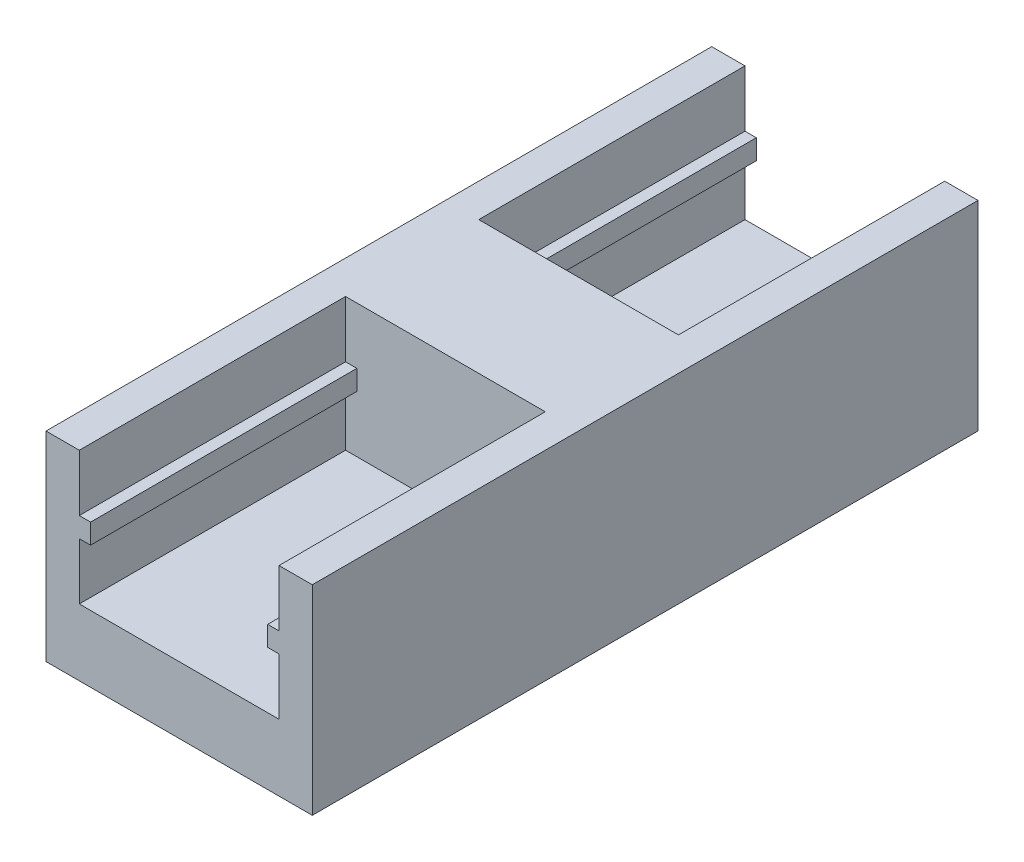
ISO-10303-21;
HEADER;
FILE_DESCRIPTION(('STEP AP214'),'2;1');
FILE_NAME('part.step','',(''),(''),'','','');
FILE_SCHEMA(('AUTOMOTIVE_DESIGN { 1 0 10303 214 1 1 1 1 }'));
ENDSEC;
DATA;
#1=APPLICATION_CONTEXT('core data for automotive mechanical design processes');
#2=APPLICATION_PROTOCOL_DEFINITION('international standard','automotive_design',2000,#1);
#3=PRODUCT_CONTEXT('',#1,'mechanical');
#4=PRODUCT('Part','Part','',(#3));
#5=PRODUCT_RELATED_PRODUCT_CATEGORY('part','',(#4));
#6=PRODUCT_DEFINITION_FORMATION('','',#4);
#7=PRODUCT_DEFINITION_CONTEXT('part definition',#1,'design');
#8=PRODUCT_DEFINITION('design','',#6,#7);
#9=PRODUCT_DEFINITION_SHAPE('','',#8);
#10=(LENGTH_UNIT() NAMED_UNIT(*) SI_UNIT(.MILLI.,.METRE.));
#11=(NAMED_UNIT(*) PLANE_ANGLE_UNIT() SI_UNIT($,.RADIAN.));
#12=(NAMED_UNIT(*) SI_UNIT($,.STERADIAN.) SOLID_ANGLE_UNIT());
#13=UNCERTAINTY_MEASURE_WITH_UNIT(LENGTH_MEASURE(1.E-05),#10,'distance_accuracy_value','');
#14=(GEOMETRIC_REPRESENTATION_CONTEXT(3) GLOBAL_UNCERTAINTY_ASSIGNED_CONTEXT((#13)) GLOBAL_UNIT_ASSIGNED_CONTEXT((#10,
#11,#12)) REPRESENTATION_CONTEXT('',''));
#15=CARTESIAN_POINT('',(0.,0.,0.));
#16=DIRECTION('',(0.,0.,1.));
#17=DIRECTION('',(1.,0.,0.));
#18=AXIS2_PLACEMENT_3D('',#15,#16,#17);
#19=CARTESIAN_POINT('',(-10.,7.5,50.));
#20=DIRECTION('',(0.,-1.,0.));
#21=DIRECTION('',(0.,0.,-1.));
#22=AXIS2_PLACEMENT_3D('',#19,#20,#21);
#23=PLANE('',#22);
#24=DIRECTION('',(0.,0.,-1.));
#25=VECTOR('',#24,1.);
#26=CARTESIAN_POINT('',(7.5,7.5,20.));
#27=LINE('',#26,#25);
#28=CARTESIAN_POINT('',(7.5,7.5,20.));
#29=VERTEX_POINT('',#28);
#30=CARTESIAN_POINT('',(7.5,7.5,0.));
#31=VERTEX_POINT('',#30);
#32=EDGE_CURVE('E321',#29,#31,#27,.T.);
#33=ORIENTED_EDGE('',*,*,#32,.F.);
#34=DIRECTION('',(-1.,0.,0.));
#35=VECTOR('',#34,1.);
#36=CARTESIAN_POINT('',(-7.5,7.5,20.));
#37=LINE('',#36,#35);
#38=CARTESIAN_POINT('',(-7.5,7.5,20.));
#39=VERTEX_POINT('',#38);
#40=EDGE_CURVE('E244',#29,#39,#37,.T.);
#41=ORIENTED_EDGE('',*,*,#40,.T.);
#42=DIRECTION('',(0.,0.,-1.));
#43=VECTOR('',#42,1.);
#44=CARTESIAN_POINT('',(-7.5,7.5,20.));
#45=LINE('',#44,#43);
#46=CARTESIAN_POINT('',(-7.5,7.5,0.));
#47=VERTEX_POINT('',#46);
#48=EDGE_CURVE('E325',#39,#47,#45,.T.);
#49=ORIENTED_EDGE('',*,*,#48,.T.);
#50=DIRECTION('',(-1.,0.,0.));
#51=VECTOR('',#50,1.);
#52=CARTESIAN_POINT('',(-10.,7.5,0.));
#53=LINE('',#52,#51);
#54=CARTESIAN_POINT('',(-10.,7.5,0.));
#55=VERTEX_POINT('',#54);
#56=EDGE_CURVE('E501',#47,#55,#53,.T.);
#57=ORIENTED_EDGE('',*,*,#56,.T.);
#58=DIRECTION('',(0.,0.,-1.));
#59=VECTOR('',#58,1.);
#60=CARTESIAN_POINT('',(-10.,7.5,50.));
#61=LINE('',#60,#59);
#62=CARTESIAN_POINT('',(-10.,7.5,50.));
#63=VERTEX_POINT('',#62);
#64=EDGE_CURVE('E48',#63,#55,#61,.T.);
#65=ORIENTED_EDGE('',*,*,#64,.F.);
#66=DIRECTION('',(-1.,0.,0.));
#67=VECTOR('',#66,1.);
#68=CARTESIAN_POINT('',(-10.,7.5,50.));
#69=LINE('',#68,#67);
#70=CARTESIAN_POINT('',(-7.5,7.5,50.));
#71=VERTEX_POINT('',#70);
#72=EDGE_CURVE('E485',#71,#63,#69,.T.);
#73=ORIENTED_EDGE('',*,*,#72,.F.);
#74=DIRECTION('',(0.,0.,1.));
#75=VECTOR('',#74,1.);
#76=CARTESIAN_POINT('',(-7.5,7.5,30.));
#77=LINE('',#76,#75);
#78=CARTESIAN_POINT('',(-7.5,7.5,30.));
#79=VERTEX_POINT('',#78);
#80=EDGE_CURVE('E63',#79,#71,#77,.T.);
#81=ORIENTED_EDGE('',*,*,#80,.F.);
#82=DIRECTION('',(-1.,0.,0.));
#83=VECTOR('',#82,1.);
#84=CARTESIAN_POINT('',(-7.5,7.5,30.));
#85=LINE('',#84,#83);
#86=CARTESIAN_POINT('',(7.5,7.5,30.));
#87=VERTEX_POINT('',#86);
#88=EDGE_CURVE('E359',#87,#79,#85,.T.);
#89=ORIENTED_EDGE('',*,*,#88,.F.);
#90=DIRECTION('',(0.,0.,1.));
#91=VECTOR('',#90,1.);
#92=CARTESIAN_POINT('',(7.5,7.5,30.));
#93=LINE('',#92,#91);
#94=CARTESIAN_POINT('',(7.5,7.5,50.));
#95=VERTEX_POINT('',#94);
#96=EDGE_CURVE('E404',#87,#95,#93,.T.);
#97=ORIENTED_EDGE('',*,*,#96,.T.);
#98=CARTESIAN_POINT('',(10.,7.5,50.));
#99=VERTEX_POINT('',#98);
#100=EDGE_CURVE('E487',#99,#95,#69,.T.);
#101=ORIENTED_EDGE('',*,*,#100,.F.);
#102=DIRECTION('',(0.,0.,-1.));
#103=VECTOR('',#102,1.);
#104=CARTESIAN_POINT('',(10.,7.5,50.));
#105=LINE('',#104,#103);
#106=CARTESIAN_POINT('',(10.,7.5,0.));
#107=VERTEX_POINT('',#106);
#108=EDGE_CURVE('E11',#99,#107,#105,.T.);
#109=ORIENTED_EDGE('',*,*,#108,.T.);
#110=EDGE_CURVE('E502',#107,#31,#53,.T.);
#111=ORIENTED_EDGE('',*,*,#110,.T.);
#112=EDGE_LOOP('',(#33,#41,#49,#57,#65,#73,#81,#89,#97,#101,#109,#111));
#113=FACE_BOUND('',#112,.T.);
#114=ADVANCED_FACE('F39',(#113),#23,.F.);
#115=CARTESIAN_POINT('',(0.,0.,0.));
#116=DIRECTION('',(0.,0.,-1.));
#117=DIRECTION('',(-1.,0.,0.));
#118=AXIS2_PLACEMENT_3D('',#115,#116,#117);
#119=PLANE('',#118);
#120=DIRECTION('',(1.,0.,0.));
#121=VECTOR('',#120,1.);
#122=CARTESIAN_POINT('',(6.65,3.25,0.));
#123=LINE('',#122,#121);
#124=CARTESIAN_POINT('',(6.65,3.25,0.));
#125=VERTEX_POINT('',#124);
#126=CARTESIAN_POINT('',(7.5,3.25,0.));
#127=VERTEX_POINT('',#126);
#128=EDGE_CURVE('E287',#125,#127,#123,.T.);
#129=ORIENTED_EDGE('',*,*,#128,.T.);
#130=DIRECTION('',(0.,1.,0.));
#131=VECTOR('',#130,1.);
#132=CARTESIAN_POINT('',(7.5,3.25,0.));
#133=LINE('',#132,#131);
#134=EDGE_CURVE('E55',#127,#31,#133,.T.);
#135=ORIENTED_EDGE('',*,*,#134,.T.);
#136=ORIENTED_EDGE('',*,*,#110,.F.);
#137=DIRECTION('',(0.,1.,0.));
#138=VECTOR('',#137,1.);
#139=CARTESIAN_POINT('',(10.,-7.5,0.));
#140=LINE('',#139,#138);
#141=CARTESIAN_POINT('',(10.,-7.5,0.));
#142=VERTEX_POINT('',#141);
#143=EDGE_CURVE('E448',#142,#107,#140,.T.);
#144=ORIENTED_EDGE('',*,*,#143,.F.);
#145=DIRECTION('',(1.,0.,0.));
#146=VECTOR('',#145,1.);
#147=CARTESIAN_POINT('',(-10.,-7.5,0.));
#148=LINE('',#147,#146);
#149=CARTESIAN_POINT('',(-10.,-7.5,0.));
#150=VERTEX_POINT('',#149);
#151=EDGE_CURVE('E486',#150,#142,#148,.T.);
#152=ORIENTED_EDGE('',*,*,#151,.F.);
#153=DIRECTION('',(0.,-1.,0.));
#154=VECTOR('',#153,1.);
#155=CARTESIAN_POINT('',(-10.,-7.5,0.));
#156=LINE('',#155,#154);
#157=EDGE_CURVE('E506',#55,#150,#156,.T.);
#158=ORIENTED_EDGE('',*,*,#157,.F.);
#159=ORIENTED_EDGE('',*,*,#56,.F.);
#160=DIRECTION('',(0.,-1.,0.));
#161=VECTOR('',#160,1.);
#162=CARTESIAN_POINT('',(-7.5,3.25,0.));
#163=LINE('',#162,#161);
#164=CARTESIAN_POINT('',(-7.5,3.25,0.));
#165=VERTEX_POINT('',#164);
#166=EDGE_CURVE('E250',#47,#165,#163,.T.);
#167=ORIENTED_EDGE('',*,*,#166,.T.);
#168=DIRECTION('',(1.,0.,0.));
#169=VECTOR('',#168,1.);
#170=CARTESIAN_POINT('',(-6.65,3.25,0.));
#171=LINE('',#170,#169);
#172=CARTESIAN_POINT('',(-6.65,3.25,0.));
#173=VERTEX_POINT('',#172);
#174=EDGE_CURVE('E254',#165,#173,#171,.T.);
#175=ORIENTED_EDGE('',*,*,#174,.T.);
#176=DIRECTION('',(0.,-1.,0.));
#177=VECTOR('',#176,1.);
#178=CARTESIAN_POINT('',(-6.65,1.75,0.));
#179=LINE('',#178,#177);
#180=CARTESIAN_POINT('',(-6.65,1.75,0.));
#181=VERTEX_POINT('',#180);
#182=EDGE_CURVE('E314',#173,#181,#179,.T.);
#183=ORIENTED_EDGE('',*,*,#182,.T.);
#184=DIRECTION('',(-1.,0.,0.));
#185=VECTOR('',#184,1.);
#186=CARTESIAN_POINT('',(-6.65,1.75,0.));
#187=LINE('',#186,#185);
#188=CARTESIAN_POINT('',(-7.5,1.75,0.));
#189=VERTEX_POINT('',#188);
#190=EDGE_CURVE('E310',#181,#189,#187,.T.);
#191=ORIENTED_EDGE('',*,*,#190,.T.);
#192=DIRECTION('',(0.,-1.,0.));
#193=VECTOR('',#192,1.);
#194=CARTESIAN_POINT('',(-7.5,-2.5,0.));
#195=LINE('',#194,#193);
#196=CARTESIAN_POINT('',(-7.5,-2.5,0.));
#197=VERTEX_POINT('',#196);
#198=EDGE_CURVE('E306',#189,#197,#195,.T.);
#199=ORIENTED_EDGE('',*,*,#198,.T.);
#200=DIRECTION('',(1.,0.,0.));
#201=VECTOR('',#200,1.);
#202=CARTESIAN_POINT('',(-7.5,-2.5,0.));
#203=LINE('',#202,#201);
#204=CARTESIAN_POINT('',(7.5,-2.5,0.));
#205=VERTEX_POINT('',#204);
#206=EDGE_CURVE('E302',#197,#205,#203,.T.);
#207=ORIENTED_EDGE('',*,*,#206,.T.);
#208=DIRECTION('',(0.,1.,0.));
#209=VECTOR('',#208,1.);
#210=CARTESIAN_POINT('',(7.5,-2.5,0.));
#211=LINE('',#210,#209);
#212=CARTESIAN_POINT('',(7.5,1.75,0.));
#213=VERTEX_POINT('',#212);
#214=EDGE_CURVE('E298',#205,#213,#211,.T.);
#215=ORIENTED_EDGE('',*,*,#214,.T.);
#216=DIRECTION('',(-1.,0.,0.));
#217=VECTOR('',#216,1.);
#218=CARTESIAN_POINT('',(6.65,1.75,0.));
#219=LINE('',#218,#217);
#220=CARTESIAN_POINT('',(6.65,1.75,0.));
#221=VERTEX_POINT('',#220);
#222=EDGE_CURVE('E294',#213,#221,#219,.T.);
#223=ORIENTED_EDGE('',*,*,#222,.T.);
#224=DIRECTION('',(0.,1.,0.));
#225=VECTOR('',#224,1.);
#226=CARTESIAN_POINT('',(6.65,1.75,0.));
#227=LINE('',#226,#225);
#228=EDGE_CURVE('E290',#221,#125,#227,.T.);
#229=ORIENTED_EDGE('',*,*,#228,.T.);
#230=EDGE_LOOP('',(#129,#135,#136,#144,#152,#158,#159,#167,#175,#183,#191,#199,#207,#215,#223,#229));
#231=FACE_BOUND('',#230,.T.);
#232=ADVANCED_FACE('F530',(#231),#119,.T.);
#233=CARTESIAN_POINT('',(10.,-7.5,50.));
#234=DIRECTION('',(-1.,0.,0.));
#235=DIRECTION('',(0.,0.,1.));
#236=AXIS2_PLACEMENT_3D('',#233,#234,#235);
#237=PLANE('',#236);
#238=ORIENTED_EDGE('',*,*,#143,.T.);
#239=ORIENTED_EDGE('',*,*,#108,.F.);
#240=DIRECTION('',(0.,1.,0.));
#241=VECTOR('',#240,1.);
#242=CARTESIAN_POINT('',(10.,-7.5,50.));
#243=LINE('',#242,#241);
#244=CARTESIAN_POINT('',(10.,-7.5,50.));
#245=VERTEX_POINT('',#244);
#246=EDGE_CURVE('E481',#245,#99,#243,.T.);
#247=ORIENTED_EDGE('',*,*,#246,.F.);
#248=DIRECTION('',(0.,0.,-1.));
#249=VECTOR('',#248,1.);
#250=CARTESIAN_POINT('',(10.,-7.5,50.));
#251=LINE('',#250,#249);
#252=EDGE_CURVE('E497',#245,#142,#251,.T.);
#253=ORIENTED_EDGE('',*,*,#252,.T.);
#254=EDGE_LOOP('',(#238,#239,#247,#253));
#255=FACE_BOUND('',#254,.T.);
#256=ADVANCED_FACE('F41',(#255),#237,.F.);
#257=CARTESIAN_POINT('',(-10.,-7.5,50.));
#258=DIRECTION('',(1.,0.,0.));
#259=DIRECTION('',(0.,0.,-1.));
#260=AXIS2_PLACEMENT_3D('',#257,#258,#259);
#261=PLANE('',#260);
#262=ORIENTED_EDGE('',*,*,#157,.T.);
#263=DIRECTION('',(0.,0.,-1.));
#264=VECTOR('',#263,1.);
#265=CARTESIAN_POINT('',(-10.,-7.5,50.));
#266=LINE('',#265,#264);
#267=CARTESIAN_POINT('',(-10.,-7.5,50.));
#268=VERTEX_POINT('',#267);
#269=EDGE_CURVE('E514',#268,#150,#266,.T.);
#270=ORIENTED_EDGE('',*,*,#269,.F.);
#271=DIRECTION('',(0.,-1.,0.));
#272=VECTOR('',#271,1.);
#273=CARTESIAN_POINT('',(-10.,-7.5,50.));
#274=LINE('',#273,#272);
#275=EDGE_CURVE('E491',#63,#268,#274,.T.);
#276=ORIENTED_EDGE('',*,*,#275,.F.);
#277=ORIENTED_EDGE('',*,*,#64,.T.);
#278=EDGE_LOOP('',(#262,#270,#276,#277));
#279=FACE_BOUND('',#278,.T.);
#280=ADVANCED_FACE('F523',(#279),#261,.F.);
#281=CARTESIAN_POINT('',(-10.,-7.5,50.));
#282=DIRECTION('',(0.,1.,0.));
#283=DIRECTION('',(0.,0.,1.));
#284=AXIS2_PLACEMENT_3D('',#281,#282,#283);
#285=PLANE('',#284);
#286=ORIENTED_EDGE('',*,*,#151,.T.);
#287=ORIENTED_EDGE('',*,*,#252,.F.);
#288=DIRECTION('',(1.,0.,0.));
#289=VECTOR('',#288,1.);
#290=CARTESIAN_POINT('',(-10.,-7.5,50.));
#291=LINE('',#290,#289);
#292=EDGE_CURVE('E494',#268,#245,#291,.T.);
#293=ORIENTED_EDGE('',*,*,#292,.F.);
#294=ORIENTED_EDGE('',*,*,#269,.T.);
#295=EDGE_LOOP('',(#286,#287,#293,#294));
#296=FACE_BOUND('',#295,.T.);
#297=ADVANCED_FACE('F534',(#296),#285,.F.);
#298=CARTESIAN_POINT('',(0.,0.,50.));
#299=DIRECTION('',(0.,0.,-1.));
#300=DIRECTION('',(-1.,0.,0.));
#301=AXIS2_PLACEMENT_3D('',#298,#299,#300);
#302=PLANE('',#301);
#303=ORIENTED_EDGE('',*,*,#100,.T.);
#304=DIRECTION('',(0.,1.,0.));
#305=VECTOR('',#304,1.);
#306=CARTESIAN_POINT('',(7.5,3.25,50.));
#307=LINE('',#306,#305);
#308=CARTESIAN_POINT('',(7.5,3.25,50.));
#309=VERTEX_POINT('',#308);
#310=EDGE_CURVE('E324',#309,#95,#307,.T.);
#311=ORIENTED_EDGE('',*,*,#310,.F.);
#312=DIRECTION('',(1.,0.,0.));
#313=VECTOR('',#312,1.);
#314=CARTESIAN_POINT('',(6.65,3.25,50.));
#315=LINE('',#314,#313);
#316=CARTESIAN_POINT('',(6.65,3.25,50.));
#317=VERTEX_POINT('',#316);
#318=EDGE_CURVE('E360',#317,#309,#315,.T.);
#319=ORIENTED_EDGE('',*,*,#318,.F.);
#320=DIRECTION('',(0.,1.,0.));
#321=VECTOR('',#320,1.);
#322=CARTESIAN_POINT('',(6.65,1.75,50.));
#323=LINE('',#322,#321);
#324=CARTESIAN_POINT('',(6.65,1.75,50.));
#325=VERTEX_POINT('',#324);
#326=EDGE_CURVE('E438',#325,#317,#323,.T.);
#327=ORIENTED_EDGE('',*,*,#326,.F.);
#328=DIRECTION('',(-1.,0.,0.));
#329=VECTOR('',#328,1.);
#330=CARTESIAN_POINT('',(6.65,1.75,50.));
#331=LINE('',#330,#329);
#332=CARTESIAN_POINT('',(7.5,1.75,50.));
#333=VERTEX_POINT('',#332);
#334=EDGE_CURVE('E434',#333,#325,#331,.T.);
#335=ORIENTED_EDGE('',*,*,#334,.F.);
#336=DIRECTION('',(0.,1.,0.));
#337=VECTOR('',#336,1.);
#338=CARTESIAN_POINT('',(7.5,-2.5,50.));
#339=LINE('',#338,#337);
#340=CARTESIAN_POINT('',(7.5,-2.5,50.));
#341=VERTEX_POINT('',#340);
#342=EDGE_CURVE('E430',#341,#333,#339,.T.);
#343=ORIENTED_EDGE('',*,*,#342,.F.);
#344=DIRECTION('',(1.,0.,0.));
#345=VECTOR('',#344,1.);
#346=CARTESIAN_POINT('',(-7.5,-2.5,50.));
#347=LINE('',#346,#345);
#348=CARTESIAN_POINT('',(-7.5,-2.5,50.));
#349=VERTEX_POINT('',#348);
#350=EDGE_CURVE('E426',#349,#341,#347,.T.);
#351=ORIENTED_EDGE('',*,*,#350,.F.);
#352=DIRECTION('',(0.,-1.,0.));
#353=VECTOR('',#352,1.);
#354=CARTESIAN_POINT('',(-7.5,-2.5,50.));
#355=LINE('',#354,#353);
#356=CARTESIAN_POINT('',(-7.5,1.75,50.));
#357=VERTEX_POINT('',#356);
#358=EDGE_CURVE('E422',#357,#349,#355,.T.);
#359=ORIENTED_EDGE('',*,*,#358,.F.);
#360=DIRECTION('',(-1.,0.,0.));
#361=VECTOR('',#360,1.);
#362=CARTESIAN_POINT('',(-6.65,1.75,50.));
#363=LINE('',#362,#361);
#364=CARTESIAN_POINT('',(-6.65,1.75,50.));
#365=VERTEX_POINT('',#364);
#366=EDGE_CURVE('E418',#365,#357,#363,.T.);
#367=ORIENTED_EDGE('',*,*,#366,.F.);
#368=DIRECTION('',(0.,-1.,0.));
#369=VECTOR('',#368,1.);
#370=CARTESIAN_POINT('',(-6.65,1.75,50.));
#371=LINE('',#370,#369);
#372=CARTESIAN_POINT('',(-6.65,3.25,50.));
#373=VERTEX_POINT('',#372);
#374=EDGE_CURVE('E414',#373,#365,#371,.T.);
#375=ORIENTED_EDGE('',*,*,#374,.F.);
#376=DIRECTION('',(1.,0.,0.));
#377=VECTOR('',#376,1.);
#378=CARTESIAN_POINT('',(-6.65,3.25,50.));
#379=LINE('',#378,#377);
#380=CARTESIAN_POINT('',(-7.5,3.25,50.));
#381=VERTEX_POINT('',#380);
#382=EDGE_CURVE('E410',#381,#373,#379,.T.);
#383=ORIENTED_EDGE('',*,*,#382,.F.);
#384=DIRECTION('',(0.,-1.,0.));
#385=VECTOR('',#384,1.);
#386=CARTESIAN_POINT('',(-7.5,3.25,50.));
#387=LINE('',#386,#385);
#388=EDGE_CURVE('E407',#71,#381,#387,.T.);
#389=ORIENTED_EDGE('',*,*,#388,.F.);
#390=ORIENTED_EDGE('',*,*,#72,.T.);
#391=ORIENTED_EDGE('',*,*,#275,.T.);
#392=ORIENTED_EDGE('',*,*,#292,.T.);
#393=ORIENTED_EDGE('',*,*,#246,.T.);
#394=EDGE_LOOP('',(#303,#311,#319,#327,#335,#343,#351,#359,#367,#375,#383,#389,#390,#391,#392,#393));
#395=FACE_BOUND('',#394,.T.);
#396=ADVANCED_FACE('F540',(#395),#302,.F.);
#397=CARTESIAN_POINT('',(7.5,3.25,30.));
#398=DIRECTION('',(1.,0.,0.));
#399=DIRECTION('',(0.,1.,0.));
#400=AXIS2_PLACEMENT_3D('',#397,#398,#399);
#401=PLANE('',#400);
#402=ORIENTED_EDGE('',*,*,#310,.T.);
#403=ORIENTED_EDGE('',*,*,#96,.F.);
#404=DIRECTION('',(0.,1.,0.));
#405=VECTOR('',#404,1.);
#406=CARTESIAN_POINT('',(7.5,3.25,30.));
#407=LINE('',#406,#405);
#408=CARTESIAN_POINT('',(7.5,3.25,30.));
#409=VERTEX_POINT('',#408);
#410=EDGE_CURVE('E355',#409,#87,#407,.T.);
#411=ORIENTED_EDGE('',*,*,#410,.F.);
#412=DIRECTION('',(0.,0.,1.));
#413=VECTOR('',#412,1.);
#414=CARTESIAN_POINT('',(7.5,3.25,30.));
#415=LINE('',#414,#413);
#416=EDGE_CURVE('E445',#409,#309,#415,.T.);
#417=ORIENTED_EDGE('',*,*,#416,.T.);
#418=EDGE_LOOP('',(#402,#403,#411,#417));
#419=FACE_BOUND('',#418,.T.);
#420=ADVANCED_FACE('F589',(#419),#401,.F.);
#421=CARTESIAN_POINT('',(6.65,3.25,30.));
#422=DIRECTION('',(0.,-1.,0.));
#423=DIRECTION('',(0.,0.,-1.));
#424=AXIS2_PLACEMENT_3D('',#421,#422,#423);
#425=PLANE('',#424);
#426=ORIENTED_EDGE('',*,*,#318,.T.);
#427=ORIENTED_EDGE('',*,*,#416,.F.);
#428=DIRECTION('',(1.,0.,0.));
#429=VECTOR('',#428,1.);
#430=CARTESIAN_POINT('',(6.65,3.25,30.));
#431=LINE('',#430,#429);
#432=CARTESIAN_POINT('',(6.65,3.25,30.));
#433=VERTEX_POINT('',#432);
#434=EDGE_CURVE('E400',#433,#409,#431,.T.);
#435=ORIENTED_EDGE('',*,*,#434,.F.);
#436=DIRECTION('',(0.,0.,1.));
#437=VECTOR('',#436,1.);
#438=CARTESIAN_POINT('',(6.65,3.25,30.));
#439=LINE('',#438,#437);
#440=EDGE_CURVE('E449',#433,#317,#439,.T.);
#441=ORIENTED_EDGE('',*,*,#440,.T.);
#442=EDGE_LOOP('',(#426,#427,#435,#441));
#443=FACE_BOUND('',#442,.T.);
#444=ADVANCED_FACE('F595',(#443),#425,.F.);
#445=CARTESIAN_POINT('',(6.65,1.75,30.));
#446=DIRECTION('',(1.,0.,0.));
#447=DIRECTION('',(0.,0.,-1.));
#448=AXIS2_PLACEMENT_3D('',#445,#446,#447);
#449=PLANE('',#448);
#450=ORIENTED_EDGE('',*,*,#326,.T.);
#451=ORIENTED_EDGE('',*,*,#440,.F.);
#452=DIRECTION('',(0.,1.,0.));
#453=VECTOR('',#452,1.);
#454=CARTESIAN_POINT('',(6.65,1.75,30.));
#455=LINE('',#454,#453);
#456=CARTESIAN_POINT('',(6.65,1.75,30.));
#457=VERTEX_POINT('',#456);
#458=EDGE_CURVE('E396',#457,#433,#455,.T.);
#459=ORIENTED_EDGE('',*,*,#458,.F.);
#460=DIRECTION('',(0.,0.,1.));
#461=VECTOR('',#460,1.);
#462=CARTESIAN_POINT('',(6.65,1.75,30.));
#463=LINE('',#462,#461);
#464=EDGE_CURVE('E452',#457,#325,#463,.T.);
#465=ORIENTED_EDGE('',*,*,#464,.T.);
#466=EDGE_LOOP('',(#450,#451,#459,#465));
#467=FACE_BOUND('',#466,.T.);
#468=ADVANCED_FACE('F601',(#467),#449,.F.);
#469=CARTESIAN_POINT('',(6.65,1.75,30.));
#470=DIRECTION('',(0.,1.,0.));
#471=DIRECTION('',(-1.,0.,0.));
#472=AXIS2_PLACEMENT_3D('',#469,#470,#471);
#473=PLANE('',#472);
#474=ORIENTED_EDGE('',*,*,#334,.T.);
#475=ORIENTED_EDGE('',*,*,#464,.F.);
#476=DIRECTION('',(-1.,0.,0.));
#477=VECTOR('',#476,1.);
#478=CARTESIAN_POINT('',(6.65,1.75,30.));
#479=LINE('',#478,#477);
#480=CARTESIAN_POINT('',(7.5,1.75,30.));
#481=VERTEX_POINT('',#480);
#482=EDGE_CURVE('E392',#481,#457,#479,.T.);
#483=ORIENTED_EDGE('',*,*,#482,.F.);
#484=DIRECTION('',(0.,0.,1.));
#485=VECTOR('',#484,1.);
#486=CARTESIAN_POINT('',(7.5,1.75,30.));
#487=LINE('',#486,#485);
#488=EDGE_CURVE('E455',#481,#333,#487,.T.);
#489=ORIENTED_EDGE('',*,*,#488,.T.);
#490=EDGE_LOOP('',(#474,#475,#483,#489));
#491=FACE_BOUND('',#490,.T.);
#492=ADVANCED_FACE('F604',(#491),#473,.F.);
#493=CARTESIAN_POINT('',(7.5,-2.5,30.));
#494=DIRECTION('',(1.,0.,0.));
#495=DIRECTION('',(0.,0.,-1.));
#496=AXIS2_PLACEMENT_3D('',#493,#494,#495);
#497=PLANE('',#496);
#498=ORIENTED_EDGE('',*,*,#342,.T.);
#499=ORIENTED_EDGE('',*,*,#488,.F.);
#500=DIRECTION('',(0.,1.,0.));
#501=VECTOR('',#500,1.);
#502=CARTESIAN_POINT('',(7.5,-2.5,30.));
#503=LINE('',#502,#501);
#504=CARTESIAN_POINT('',(7.5,-2.5,30.));
#505=VERTEX_POINT('',#504);
#506=EDGE_CURVE('E388',#505,#481,#503,.T.);
#507=ORIENTED_EDGE('',*,*,#506,.F.);
#508=DIRECTION('',(0.,0.,1.));
#509=VECTOR('',#508,1.);
#510=CARTESIAN_POINT('',(7.5,-2.5,30.));
#511=LINE('',#510,#509);
#512=EDGE_CURVE('E458',#505,#341,#511,.T.);
#513=ORIENTED_EDGE('',*,*,#512,.T.);
#514=EDGE_LOOP('',(#498,#499,#507,#513));
#515=FACE_BOUND('',#514,.T.);
#516=ADVANCED_FACE('F607',(#515),#497,.F.);
#517=CARTESIAN_POINT('',(-7.5,-2.5,30.));
#518=DIRECTION('',(0.,-1.,0.));
#519=DIRECTION('',(1.,0.,0.));
#520=AXIS2_PLACEMENT_3D('',#517,#518,#519);
#521=PLANE('',#520);
#522=ORIENTED_EDGE('',*,*,#350,.T.);
#523=ORIENTED_EDGE('',*,*,#512,.F.);
#524=DIRECTION('',(1.,0.,0.));
#525=VECTOR('',#524,1.);
#526=CARTESIAN_POINT('',(-7.5,-2.5,30.));
#527=LINE('',#526,#525);
#528=CARTESIAN_POINT('',(-7.5,-2.5,30.));
#529=VERTEX_POINT('',#528);
#530=EDGE_CURVE('E384',#529,#505,#527,.T.);
#531=ORIENTED_EDGE('',*,*,#530,.F.);
#532=DIRECTION('',(0.,0.,1.));
#533=VECTOR('',#532,1.);
#534=CARTESIAN_POINT('',(-7.5,-2.5,30.));
#535=LINE('',#534,#533);
#536=EDGE_CURVE('E461',#529,#349,#535,.T.);
#537=ORIENTED_EDGE('',*,*,#536,.T.);
#538=EDGE_LOOP('',(#522,#523,#531,#537));
#539=FACE_BOUND('',#538,.T.);
#540=ADVANCED_FACE('F612',(#539),#521,.F.);
#541=CARTESIAN_POINT('',(-7.5,-2.5,30.));
#542=DIRECTION('',(-1.,0.,0.));
#543=DIRECTION('',(0.,-1.,0.));
#544=AXIS2_PLACEMENT_3D('',#541,#542,#543);
#545=PLANE('',#544);
#546=ORIENTED_EDGE('',*,*,#358,.T.);
#547=ORIENTED_EDGE('',*,*,#536,.F.);
#548=DIRECTION('',(0.,-1.,0.));
#549=VECTOR('',#548,1.);
#550=CARTESIAN_POINT('',(-7.5,-2.5,30.));
#551=LINE('',#550,#549);
#552=CARTESIAN_POINT('',(-7.5,1.75,30.));
#553=VERTEX_POINT('',#552);
#554=EDGE_CURVE('E380',#553,#529,#551,.T.);
#555=ORIENTED_EDGE('',*,*,#554,.F.);
#556=DIRECTION('',(0.,0.,1.));
#557=VECTOR('',#556,1.);
#558=CARTESIAN_POINT('',(-7.5,1.75,30.));
#559=LINE('',#558,#557);
#560=EDGE_CURVE('E464',#553,#357,#559,.T.);
#561=ORIENTED_EDGE('',*,*,#560,.T.);
#562=EDGE_LOOP('',(#546,#547,#555,#561));
#563=FACE_BOUND('',#562,.T.);
#564=ADVANCED_FACE('F616',(#563),#545,.F.);
#565=CARTESIAN_POINT('',(-6.65,1.75,30.));
#566=DIRECTION('',(0.,1.,0.));
#567=DIRECTION('',(-1.,0.,0.));
#568=AXIS2_PLACEMENT_3D('',#565,#566,#567);
#569=PLANE('',#568);
#570=ORIENTED_EDGE('',*,*,#366,.T.);
#571=ORIENTED_EDGE('',*,*,#560,.F.);
#572=DIRECTION('',(-1.,0.,0.));
#573=VECTOR('',#572,1.);
#574=CARTESIAN_POINT('',(-6.65,1.75,30.));
#575=LINE('',#574,#573);
#576=CARTESIAN_POINT('',(-6.65,1.75,30.));
#577=VERTEX_POINT('',#576);
#578=EDGE_CURVE('E376',#577,#553,#575,.T.);
#579=ORIENTED_EDGE('',*,*,#578,.F.);
#580=DIRECTION('',(0.,0.,1.));
#581=VECTOR('',#580,1.);
#582=CARTESIAN_POINT('',(-6.65,1.75,30.));
#583=LINE('',#582,#581);
#584=EDGE_CURVE('E467',#577,#365,#583,.T.);
#585=ORIENTED_EDGE('',*,*,#584,.T.);
#586=EDGE_LOOP('',(#570,#571,#579,#585));
#587=FACE_BOUND('',#586,.T.);
#588=ADVANCED_FACE('F619',(#587),#569,.F.);
#589=CARTESIAN_POINT('',(-6.65,1.75,30.));
#590=DIRECTION('',(-1.,0.,0.));
#591=DIRECTION('',(0.,-1.,0.));
#592=AXIS2_PLACEMENT_3D('',#589,#590,#591);
#593=PLANE('',#592);
#594=ORIENTED_EDGE('',*,*,#374,.T.);
#595=ORIENTED_EDGE('',*,*,#584,.F.);
#596=DIRECTION('',(0.,-1.,0.));
#597=VECTOR('',#596,1.);
#598=CARTESIAN_POINT('',(-6.65,1.75,30.));
#599=LINE('',#598,#597);
#600=CARTESIAN_POINT('',(-6.65,3.25,30.));
#601=VERTEX_POINT('',#600);
#602=EDGE_CURVE('E372',#601,#577,#599,.T.);
#603=ORIENTED_EDGE('',*,*,#602,.F.);
#604=DIRECTION('',(0.,0.,1.));
#605=VECTOR('',#604,1.);
#606=CARTESIAN_POINT('',(-6.65,3.25,30.));
#607=LINE('',#606,#605);
#608=EDGE_CURVE('E470',#601,#373,#607,.T.);
#609=ORIENTED_EDGE('',*,*,#608,.T.);
#610=EDGE_LOOP('',(#594,#595,#603,#609));
#611=FACE_BOUND('',#610,.T.);
#612=ADVANCED_FACE('F622',(#611),#593,.F.);
#613=CARTESIAN_POINT('',(-6.65,3.25,30.));
#614=DIRECTION('',(0.,-1.,0.));
#615=DIRECTION('',(0.,0.,-1.));
#616=AXIS2_PLACEMENT_3D('',#613,#614,#615);
#617=PLANE('',#616);
#618=ORIENTED_EDGE('',*,*,#382,.T.);
#619=ORIENTED_EDGE('',*,*,#608,.F.);
#620=DIRECTION('',(1.,0.,0.));
#621=VECTOR('',#620,1.);
#622=CARTESIAN_POINT('',(-6.65,3.25,30.));
#623=LINE('',#622,#621);
#624=CARTESIAN_POINT('',(-7.5,3.25,30.));
#625=VERTEX_POINT('',#624);
#626=EDGE_CURVE('E368',#625,#601,#623,.T.);
#627=ORIENTED_EDGE('',*,*,#626,.F.);
#628=DIRECTION('',(0.,0.,1.));
#629=VECTOR('',#628,1.);
#630=CARTESIAN_POINT('',(-7.5,3.25,30.));
#631=LINE('',#630,#629);
#632=EDGE_CURVE('E473',#625,#381,#631,.T.);
#633=ORIENTED_EDGE('',*,*,#632,.T.);
#634=EDGE_LOOP('',(#618,#619,#627,#633));
#635=FACE_BOUND('',#634,.T.);
#636=ADVANCED_FACE('F626',(#635),#617,.F.);
#637=CARTESIAN_POINT('',(-7.5,3.25,30.));
#638=DIRECTION('',(-1.,0.,0.));
#639=DIRECTION('',(0.,0.,1.));
#640=AXIS2_PLACEMENT_3D('',#637,#638,#639);
#641=PLANE('',#640);
#642=ORIENTED_EDGE('',*,*,#388,.T.);
#643=ORIENTED_EDGE('',*,*,#632,.F.);
#644=DIRECTION('',(0.,-1.,0.));
#645=VECTOR('',#644,1.);
#646=CARTESIAN_POINT('',(-7.5,3.25,30.));
#647=LINE('',#646,#645);
#648=EDGE_CURVE('E364',#79,#625,#647,.T.);
#649=ORIENTED_EDGE('',*,*,#648,.F.);
#650=ORIENTED_EDGE('',*,*,#80,.T.);
#651=EDGE_LOOP('',(#642,#643,#649,#650));
#652=FACE_BOUND('',#651,.T.);
#653=ADVANCED_FACE('F627',(#652),#641,.F.);
#654=CARTESIAN_POINT('',(0.,0.,30.));
#655=DIRECTION('',(0.,0.,-1.));
#656=DIRECTION('',(-1.,0.,0.));
#657=AXIS2_PLACEMENT_3D('',#654,#655,#656);
#658=PLANE('',#657);
#659=ORIENTED_EDGE('',*,*,#410,.T.);
#660=ORIENTED_EDGE('',*,*,#88,.T.);
#661=ORIENTED_EDGE('',*,*,#648,.T.);
#662=ORIENTED_EDGE('',*,*,#626,.T.);
#663=ORIENTED_EDGE('',*,*,#602,.T.);
#664=ORIENTED_EDGE('',*,*,#578,.T.);
#665=ORIENTED_EDGE('',*,*,#554,.T.);
#666=ORIENTED_EDGE('',*,*,#530,.T.);
#667=ORIENTED_EDGE('',*,*,#506,.T.);
#668=ORIENTED_EDGE('',*,*,#482,.T.);
#669=ORIENTED_EDGE('',*,*,#458,.T.);
#670=ORIENTED_EDGE('',*,*,#434,.T.);
#671=EDGE_LOOP('',(#659,#660,#661,#662,#663,#664,#665,#666,#667,#668,#669,#670));
#672=FACE_BOUND('',#671,.T.);
#673=ADVANCED_FACE('F591',(#672),#658,.F.);
#674=CARTESIAN_POINT('',(7.5,3.25,20.));
#675=DIRECTION('',(-1.,0.,0.));
#676=DIRECTION('',(0.,-1.,0.));
#677=AXIS2_PLACEMENT_3D('',#674,#675,#676);
#678=PLANE('',#677);
#679=ORIENTED_EDGE('',*,*,#134,.F.);
#680=DIRECTION('',(0.,0.,-1.));
#681=VECTOR('',#680,1.);
#682=CARTESIAN_POINT('',(7.5,3.25,20.));
#683=LINE('',#682,#681);
#684=CARTESIAN_POINT('',(7.5,3.25,20.));
#685=VERTEX_POINT('',#684);
#686=EDGE_CURVE('E230',#685,#127,#683,.T.);
#687=ORIENTED_EDGE('',*,*,#686,.F.);
#688=DIRECTION('',(0.,1.,0.));
#689=VECTOR('',#688,1.);
#690=CARTESIAN_POINT('',(7.5,3.25,20.));
#691=LINE('',#690,#689);
#692=EDGE_CURVE('E238',#685,#29,#691,.T.);
#693=ORIENTED_EDGE('',*,*,#692,.T.);
#694=ORIENTED_EDGE('',*,*,#32,.T.);
#695=EDGE_LOOP('',(#679,#687,#693,#694));
#696=FACE_BOUND('',#695,.T.);
#697=ADVANCED_FACE('F241',(#696),#678,.T.);
#698=CARTESIAN_POINT('',(-7.5,3.25,20.));
#699=DIRECTION('',(1.,0.,0.));
#700=DIRECTION('',(0.,0.,-1.));
#701=AXIS2_PLACEMENT_3D('',#698,#699,#700);
#702=PLANE('',#701);
#703=ORIENTED_EDGE('',*,*,#166,.F.);
#704=ORIENTED_EDGE('',*,*,#48,.F.);
#705=DIRECTION('',(0.,-1.,0.));
#706=VECTOR('',#705,1.);
#707=CARTESIAN_POINT('',(-7.5,3.25,20.));
#708=LINE('',#707,#706);
#709=CARTESIAN_POINT('',(-7.5,3.25,20.));
#710=VERTEX_POINT('',#709);
#711=EDGE_CURVE('E280',#39,#710,#708,.T.);
#712=ORIENTED_EDGE('',*,*,#711,.T.);
#713=DIRECTION('',(0.,0.,-1.));
#714=VECTOR('',#713,1.);
#715=CARTESIAN_POINT('',(-7.5,3.25,20.));
#716=LINE('',#715,#714);
#717=EDGE_CURVE('E329',#710,#165,#716,.T.);
#718=ORIENTED_EDGE('',*,*,#717,.T.);
#719=EDGE_LOOP('',(#703,#704,#712,#718));
#720=FACE_BOUND('',#719,.T.);
#721=ADVANCED_FACE('F546',(#720),#702,.T.);
#722=CARTESIAN_POINT('',(-6.65,3.25,20.));
#723=DIRECTION('',(0.,1.,0.));
#724=DIRECTION('',(0.,0.,1.));
#725=AXIS2_PLACEMENT_3D('',#722,#723,#724);
#726=PLANE('',#725);
#727=ORIENTED_EDGE('',*,*,#174,.F.);
#728=ORIENTED_EDGE('',*,*,#717,.F.);
#729=DIRECTION('',(1.,0.,0.));
#730=VECTOR('',#729,1.);
#731=CARTESIAN_POINT('',(-6.65,3.25,20.));
#732=LINE('',#731,#730);
#733=CARTESIAN_POINT('',(-6.65,3.25,20.));
#734=VERTEX_POINT('',#733);
#735=EDGE_CURVE('E277',#710,#734,#732,.T.);
#736=ORIENTED_EDGE('',*,*,#735,.T.);
#737=DIRECTION('',(0.,0.,-1.));
#738=VECTOR('',#737,1.);
#739=CARTESIAN_POINT('',(-6.65,3.25,20.));
#740=LINE('',#739,#738);
#741=EDGE_CURVE('E332',#734,#173,#740,.T.);
#742=ORIENTED_EDGE('',*,*,#741,.T.);
#743=EDGE_LOOP('',(#727,#728,#736,#742));
#744=FACE_BOUND('',#743,.T.);
#745=ADVANCED_FACE('F554',(#744),#726,.T.);
#746=CARTESIAN_POINT('',(-6.65,1.75,20.));
#747=DIRECTION('',(1.,0.,0.));
#748=DIRECTION('',(0.,1.,0.));
#749=AXIS2_PLACEMENT_3D('',#746,#747,#748);
#750=PLANE('',#749);
#751=ORIENTED_EDGE('',*,*,#182,.F.);
#752=ORIENTED_EDGE('',*,*,#741,.F.);
#753=DIRECTION('',(0.,-1.,0.));
#754=VECTOR('',#753,1.);
#755=CARTESIAN_POINT('',(-6.65,1.75,20.));
#756=LINE('',#755,#754);
#757=CARTESIAN_POINT('',(-6.65,1.75,20.));
#758=VERTEX_POINT('',#757);
#759=EDGE_CURVE('E274',#734,#758,#756,.T.);
#760=ORIENTED_EDGE('',*,*,#759,.T.);
#761=DIRECTION('',(0.,0.,-1.));
#762=VECTOR('',#761,1.);
#763=CARTESIAN_POINT('',(-6.65,1.75,20.));
#764=LINE('',#763,#762);
#765=EDGE_CURVE('E335',#758,#181,#764,.T.);
#766=ORIENTED_EDGE('',*,*,#765,.T.);
#767=EDGE_LOOP('',(#751,#752,#760,#766));
#768=FACE_BOUND('',#767,.T.);
#769=ADVANCED_FACE('F557',(#768),#750,.T.);
#770=CARTESIAN_POINT('',(-6.65,1.75,20.));
#771=DIRECTION('',(0.,-1.,0.));
#772=DIRECTION('',(1.,0.,0.));
#773=AXIS2_PLACEMENT_3D('',#770,#771,#772);
#774=PLANE('',#773);
#775=ORIENTED_EDGE('',*,*,#190,.F.);
#776=ORIENTED_EDGE('',*,*,#765,.F.);
#777=DIRECTION('',(-1.,0.,0.));
#778=VECTOR('',#777,1.);
#779=CARTESIAN_POINT('',(-6.65,1.75,20.));
#780=LINE('',#779,#778);
#781=CARTESIAN_POINT('',(-7.5,1.75,20.));
#782=VERTEX_POINT('',#781);
#783=EDGE_CURVE('E271',#758,#782,#780,.T.);
#784=ORIENTED_EDGE('',*,*,#783,.T.);
#785=DIRECTION('',(0.,0.,-1.));
#786=VECTOR('',#785,1.);
#787=CARTESIAN_POINT('',(-7.5,1.75,20.));
#788=LINE('',#787,#786);
#789=EDGE_CURVE('E338',#782,#189,#788,.T.);
#790=ORIENTED_EDGE('',*,*,#789,.T.);
#791=EDGE_LOOP('',(#775,#776,#784,#790));
#792=FACE_BOUND('',#791,.T.);
#793=ADVANCED_FACE('F562',(#792),#774,.T.);
#794=CARTESIAN_POINT('',(-7.5,-2.5,20.));
#795=DIRECTION('',(1.,0.,0.));
#796=DIRECTION('',(0.,1.,0.));
#797=AXIS2_PLACEMENT_3D('',#794,#795,#796);
#798=PLANE('',#797);
#799=ORIENTED_EDGE('',*,*,#198,.F.);
#800=ORIENTED_EDGE('',*,*,#789,.F.);
#801=DIRECTION('',(0.,-1.,0.));
#802=VECTOR('',#801,1.);
#803=CARTESIAN_POINT('',(-7.5,-2.5,20.));
#804=LINE('',#803,#802);
#805=CARTESIAN_POINT('',(-7.5,-2.5,20.));
#806=VERTEX_POINT('',#805);
#807=EDGE_CURVE('E268',#782,#806,#804,.T.);
#808=ORIENTED_EDGE('',*,*,#807,.T.);
#809=DIRECTION('',(0.,0.,-1.));
#810=VECTOR('',#809,1.);
#811=CARTESIAN_POINT('',(-7.5,-2.5,20.));
#812=LINE('',#811,#810);
#813=EDGE_CURVE('E341',#806,#197,#812,.T.);
#814=ORIENTED_EDGE('',*,*,#813,.T.);
#815=EDGE_LOOP('',(#799,#800,#808,#814));
#816=FACE_BOUND('',#815,.T.);
#817=ADVANCED_FACE('F566',(#816),#798,.T.);
#818=CARTESIAN_POINT('',(-7.5,-2.5,20.));
#819=DIRECTION('',(0.,1.,0.));
#820=DIRECTION('',(-1.,0.,0.));
#821=AXIS2_PLACEMENT_3D('',#818,#819,#820);
#822=PLANE('',#821);
#823=ORIENTED_EDGE('',*,*,#206,.F.);
#824=ORIENTED_EDGE('',*,*,#813,.F.);
#825=DIRECTION('',(1.,0.,0.));
#826=VECTOR('',#825,1.);
#827=CARTESIAN_POINT('',(-7.5,-2.5,20.));
#828=LINE('',#827,#826);
#829=CARTESIAN_POINT('',(7.5,-2.5,20.));
#830=VERTEX_POINT('',#829);
#831=EDGE_CURVE('E265',#806,#830,#828,.T.);
#832=ORIENTED_EDGE('',*,*,#831,.T.);
#833=DIRECTION('',(0.,0.,-1.));
#834=VECTOR('',#833,1.);
#835=CARTESIAN_POINT('',(7.5,-2.5,20.));
#836=LINE('',#835,#834);
#837=EDGE_CURVE('E344',#830,#205,#836,.T.);
#838=ORIENTED_EDGE('',*,*,#837,.T.);
#839=EDGE_LOOP('',(#823,#824,#832,#838));
#840=FACE_BOUND('',#839,.T.);
#841=ADVANCED_FACE('F571',(#840),#822,.T.);
#842=CARTESIAN_POINT('',(7.5,-2.5,20.));
#843=DIRECTION('',(-1.,0.,0.));
#844=DIRECTION('',(0.,0.,1.));
#845=AXIS2_PLACEMENT_3D('',#842,#843,#844);
#846=PLANE('',#845);
#847=ORIENTED_EDGE('',*,*,#214,.F.);
#848=ORIENTED_EDGE('',*,*,#837,.F.);
#849=DIRECTION('',(0.,1.,0.));
#850=VECTOR('',#849,1.);
#851=CARTESIAN_POINT('',(7.5,-2.5,20.));
#852=LINE('',#851,#850);
#853=CARTESIAN_POINT('',(7.5,1.75,20.));
#854=VERTEX_POINT('',#853);
#855=EDGE_CURVE('E262',#830,#854,#852,.T.);
#856=ORIENTED_EDGE('',*,*,#855,.T.);
#857=DIRECTION('',(0.,0.,-1.));
#858=VECTOR('',#857,1.);
#859=CARTESIAN_POINT('',(7.5,1.75,20.));
#860=LINE('',#859,#858);
#861=EDGE_CURVE('E347',#854,#213,#860,.T.);
#862=ORIENTED_EDGE('',*,*,#861,.T.);
#863=EDGE_LOOP('',(#847,#848,#856,#862));
#864=FACE_BOUND('',#863,.T.);
#865=ADVANCED_FACE('F576',(#864),#846,.T.);
#866=CARTESIAN_POINT('',(6.65,1.75,20.));
#867=DIRECTION('',(0.,-1.,0.));
#868=DIRECTION('',(1.,0.,0.));
#869=AXIS2_PLACEMENT_3D('',#866,#867,#868);
#870=PLANE('',#869);
#871=ORIENTED_EDGE('',*,*,#222,.F.);
#872=ORIENTED_EDGE('',*,*,#861,.F.);
#873=DIRECTION('',(-1.,0.,0.));
#874=VECTOR('',#873,1.);
#875=CARTESIAN_POINT('',(6.65,1.75,20.));
#876=LINE('',#875,#874);
#877=CARTESIAN_POINT('',(6.65,1.75,20.));
#878=VERTEX_POINT('',#877);
#879=EDGE_CURVE('E259',#854,#878,#876,.T.);
#880=ORIENTED_EDGE('',*,*,#879,.T.);
#881=DIRECTION('',(0.,0.,-1.));
#882=VECTOR('',#881,1.);
#883=CARTESIAN_POINT('',(6.65,1.75,20.));
#884=LINE('',#883,#882);
#885=EDGE_CURVE('E350',#878,#221,#884,.T.);
#886=ORIENTED_EDGE('',*,*,#885,.T.);
#887=EDGE_LOOP('',(#871,#872,#880,#886));
#888=FACE_BOUND('',#887,.T.);
#889=ADVANCED_FACE('F581',(#888),#870,.T.);
#890=CARTESIAN_POINT('',(6.65,1.75,20.));
#891=DIRECTION('',(-1.,0.,0.));
#892=DIRECTION('',(0.,0.,1.));
#893=AXIS2_PLACEMENT_3D('',#890,#891,#892);
#894=PLANE('',#893);
#895=ORIENTED_EDGE('',*,*,#228,.F.);
#896=ORIENTED_EDGE('',*,*,#885,.F.);
#897=DIRECTION('',(0.,1.,0.));
#898=VECTOR('',#897,1.);
#899=CARTESIAN_POINT('',(6.65,1.75,20.));
#900=LINE('',#899,#898);
#901=CARTESIAN_POINT('',(6.65,3.25,20.));
#902=VERTEX_POINT('',#901);
#903=EDGE_CURVE('E237',#878,#902,#900,.T.);
#904=ORIENTED_EDGE('',*,*,#903,.T.);
#905=DIRECTION('',(0.,0.,-1.));
#906=VECTOR('',#905,1.);
#907=CARTESIAN_POINT('',(6.65,3.25,20.));
#908=LINE('',#907,#906);
#909=EDGE_CURVE('E232',#902,#125,#908,.T.);
#910=ORIENTED_EDGE('',*,*,#909,.T.);
#911=EDGE_LOOP('',(#895,#896,#904,#910));
#912=FACE_BOUND('',#911,.T.);
#913=ADVANCED_FACE('F585',(#912),#894,.T.);
#914=CARTESIAN_POINT('',(6.65,3.25,20.));
#915=DIRECTION('',(0.,1.,0.));
#916=DIRECTION('',(0.,0.,1.));
#917=AXIS2_PLACEMENT_3D('',#914,#915,#916);
#918=PLANE('',#917);
#919=ORIENTED_EDGE('',*,*,#128,.F.);
#920=ORIENTED_EDGE('',*,*,#909,.F.);
#921=DIRECTION('',(1.,0.,0.));
#922=VECTOR('',#921,1.);
#923=CARTESIAN_POINT('',(6.65,3.25,20.));
#924=LINE('',#923,#922);
#925=EDGE_CURVE('E227',#902,#685,#924,.T.);
#926=ORIENTED_EDGE('',*,*,#925,.T.);
#927=ORIENTED_EDGE('',*,*,#686,.T.);
#928=EDGE_LOOP('',(#919,#920,#926,#927));
#929=FACE_BOUND('',#928,.T.);
#930=ADVANCED_FACE('F229',(#929),#918,.T.);
#931=CARTESIAN_POINT('',(0.,0.,20.));
#932=DIRECTION('',(0.,0.,1.));
#933=DIRECTION('',(-1.,0.,0.));
#934=AXIS2_PLACEMENT_3D('',#931,#932,#933);
#935=PLANE('',#934);
#936=ORIENTED_EDGE('',*,*,#692,.F.);
#937=ORIENTED_EDGE('',*,*,#925,.F.);
#938=ORIENTED_EDGE('',*,*,#903,.F.);
#939=ORIENTED_EDGE('',*,*,#879,.F.);
#940=ORIENTED_EDGE('',*,*,#855,.F.);
#941=ORIENTED_EDGE('',*,*,#831,.F.);
#942=ORIENTED_EDGE('',*,*,#807,.F.);
#943=ORIENTED_EDGE('',*,*,#783,.F.);
#944=ORIENTED_EDGE('',*,*,#759,.F.);
#945=ORIENTED_EDGE('',*,*,#735,.F.);
#946=ORIENTED_EDGE('',*,*,#711,.F.);
#947=ORIENTED_EDGE('',*,*,#40,.F.);
#948=EDGE_LOOP('',(#936,#937,#938,#939,#940,#941,#942,#943,#944,#945,#946,#947));
#949=FACE_BOUND('',#948,.T.);
#950=ADVANCED_FACE('F246',(#949),#935,.F.);
#951=CLOSED_SHELL('',(#114,#232,#256,#280,#297,#396,#420,#444,#468,#492,#516,#540,#564,#588,
#612,#636,#653,#673,#697,#721,#745,#769,#793,#817,#841,#865,#889,#913,#930,#950));
#952=MANIFOLD_SOLID_BREP('B2',#951);
#953=ADVANCED_BREP_SHAPE_REPRESENTATION('',(#18,#952),#14);
#954=SHAPE_DEFINITION_REPRESENTATION(#9,#953);
ENDSEC;
END-ISO-10303-21;
